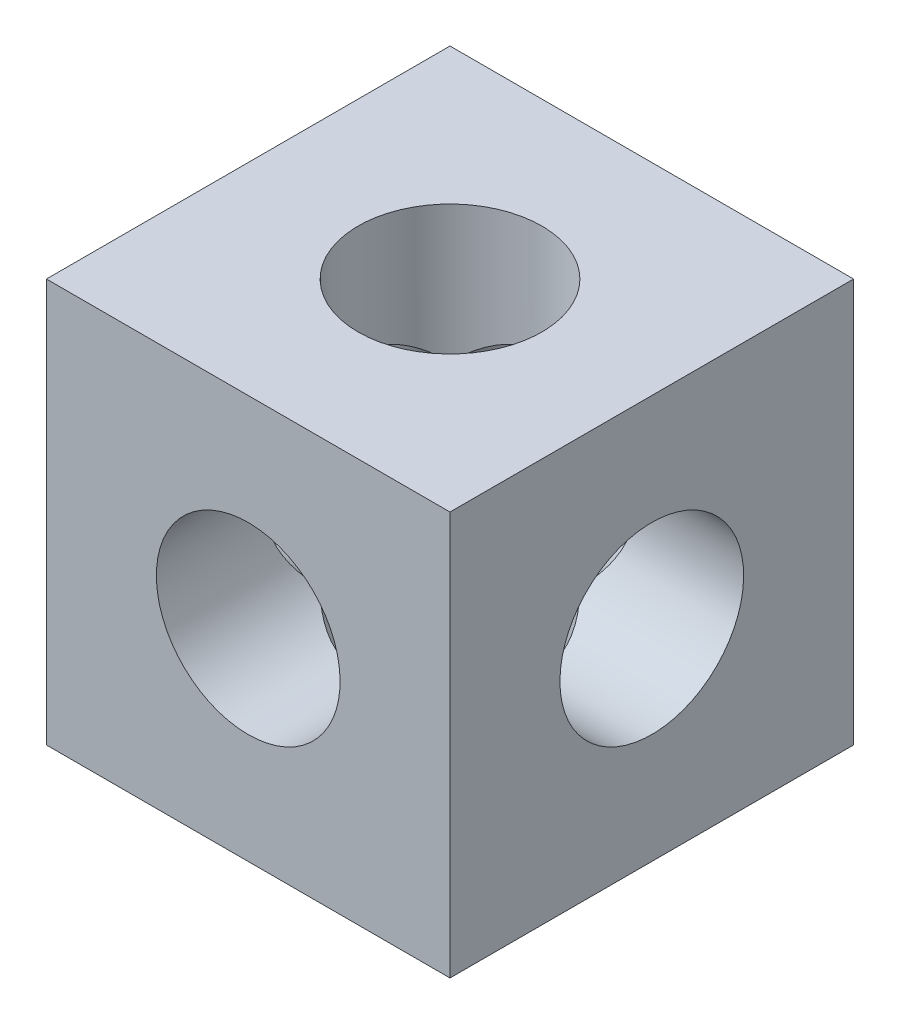
ISO-10303-21;
HEADER;
FILE_DESCRIPTION(('STEP AP214'),'2;1');
FILE_NAME('part.step','',(''),(''),'','','');
FILE_SCHEMA(('AUTOMOTIVE_DESIGN { 1 0 10303 214 1 1 1 1 }'));
ENDSEC;
DATA;
#1=APPLICATION_CONTEXT('core data for automotive mechanical design processes');
#2=APPLICATION_PROTOCOL_DEFINITION('international standard','automotive_design',2000,#1);
#3=PRODUCT_CONTEXT('',#1,'mechanical');
#4=PRODUCT('Part','Part','',(#3));
#5=PRODUCT_RELATED_PRODUCT_CATEGORY('part','',(#4));
#6=PRODUCT_DEFINITION_FORMATION('','',#4);
#7=PRODUCT_DEFINITION_CONTEXT('part definition',#1,'design');
#8=PRODUCT_DEFINITION('design','',#6,#7);
#9=PRODUCT_DEFINITION_SHAPE('','',#8);
#10=(LENGTH_UNIT() NAMED_UNIT(*) SI_UNIT(.MILLI.,.METRE.));
#11=(NAMED_UNIT(*) PLANE_ANGLE_UNIT() SI_UNIT($,.RADIAN.));
#12=(NAMED_UNIT(*) SI_UNIT($,.STERADIAN.) SOLID_ANGLE_UNIT());
#13=UNCERTAINTY_MEASURE_WITH_UNIT(LENGTH_MEASURE(1.E-05),#10,'distance_accuracy_value','');
#14=(GEOMETRIC_REPRESENTATION_CONTEXT(3) GLOBAL_UNCERTAINTY_ASSIGNED_CONTEXT((#13)) GLOBAL_UNIT_ASSIGNED_CONTEXT((#10,
#11,#12)) REPRESENTATION_CONTEXT('',''));
#15=CARTESIAN_POINT('',(0.,0.,0.));
#16=DIRECTION('',(0.,0.,1.));
#17=DIRECTION('',(1.,0.,0.));
#18=AXIS2_PLACEMENT_3D('',#15,#16,#17);
#19=CARTESIAN_POINT('',(17.4625,34.925,-17.4625));
#20=DIRECTION('',(0.,-1.,0.));
#21=DIRECTION('',(0.,0.,-1.));
#22=AXIS2_PLACEMENT_3D('',#19,#20,#21);
#23=CYLINDRICAL_SURFACE('',#22,7.9502);
#24=CARTESIAN_POINT('',(17.4625,0.,-17.4625));
#25=DIRECTION('',(0.,1.,0.));
#26=DIRECTION('',(0.,0.,1.));
#27=AXIS2_PLACEMENT_3D('',#24,#25,#26);
#28=CIRCLE('',#27,7.9502);
#29=CARTESIAN_POINT('',(17.4625,0.,-9.5123));
#30=VERTEX_POINT('',#29);
#31=EDGE_CURVE('E156',#30,#30,#28,.T.);
#32=ORIENTED_EDGE('',*,*,#31,.F.);
#33=EDGE_LOOP('',(#32));
#34=FACE_BOUND('',#33,.T.);
#35=CARTESIAN_POINT('',(17.4625,17.4625,-17.4625));
#36=DIRECTION('',(0.,-0.707106781186546,-0.707106781186549));
#37=DIRECTION('',(0.,-0.707106781186549,0.707106781186546));
#38=AXIS2_PLACEMENT_3D('',#35,#36,#37);
#39=ELLIPSE('',#38,11.2432806635786,7.9502);
#40=CARTESIAN_POINT('',(11.8408596682107,11.8408596682107,-11.8408596682107));
#41=VERTEX_POINT('',#40);
#42=CARTESIAN_POINT('',(23.0841403317893,11.8408596682107,-11.8408596682107));
#43=VERTEX_POINT('',#42);
#44=EDGE_CURVE('E106',#41,#43,#39,.F.);
#45=ORIENTED_EDGE('',*,*,#44,.T.);
#46=CARTESIAN_POINT('',(17.4625,17.4625,-17.4625));
#47=DIRECTION('',(-0.707106781186549,-0.707106781186546,0.));
#48=DIRECTION('',(0.707106781186546,-0.707106781186549,0.));
#49=AXIS2_PLACEMENT_3D('',#46,#47,#48);
#50=ELLIPSE('',#49,11.2432806635786,7.9502);
#51=CARTESIAN_POINT('',(23.0841403317893,11.8408596682107,-23.0841403317893));
#52=VERTEX_POINT('',#51);
#53=EDGE_CURVE('E52',#43,#52,#50,.F.);
#54=ORIENTED_EDGE('',*,*,#53,.T.);
#55=CARTESIAN_POINT('',(17.4625,17.4625,-17.4625));
#56=DIRECTION('',(0.,-0.707106781186549,0.707106781186546));
#57=DIRECTION('',(0.,-0.707106781186546,-0.707106781186549));
#58=AXIS2_PLACEMENT_3D('',#55,#56,#57);
#59=ELLIPSE('',#58,11.2432806635786,7.9502);
#60=CARTESIAN_POINT('',(11.8408596682107,11.8408596682107,-23.0841403317893));
#61=VERTEX_POINT('',#60);
#62=EDGE_CURVE('E111',#52,#61,#59,.F.);
#63=ORIENTED_EDGE('',*,*,#62,.T.);
#64=CARTESIAN_POINT('',(17.4625,17.4625,-17.4625));
#65=DIRECTION('',(0.707106781186546,-0.707106781186549,0.));
#66=DIRECTION('',(-0.707106781186549,-0.707106781186546,0.));
#67=AXIS2_PLACEMENT_3D('',#64,#65,#66);
#68=ELLIPSE('',#67,11.2432806635786,7.9502);
#69=EDGE_CURVE('E100',#61,#41,#68,.F.);
#70=ORIENTED_EDGE('',*,*,#69,.T.);
#71=EDGE_LOOP('',(#45,#54,#63,#70));
#72=FACE_BOUND('',#71,.T.);
#73=ADVANCED_FACE('F37',(#34,#72),#23,.F.);
#74=CARTESIAN_POINT('',(17.4625,34.925,-17.4625));
#75=DIRECTION('',(0.,1.,0.));
#76=DIRECTION('',(0.,0.,1.));
#77=AXIS2_PLACEMENT_3D('',#74,#75,#76);
#78=CIRCLE('',#77,7.9502);
#79=CARTESIAN_POINT('',(17.4625,34.925,-9.5123));
#80=VERTEX_POINT('',#79);
#81=EDGE_CURVE('E146',#80,#80,#78,.T.);
#82=ORIENTED_EDGE('',*,*,#81,.T.);
#83=EDGE_LOOP('',(#82));
#84=FACE_BOUND('',#83,.T.);
#85=CARTESIAN_POINT('',(17.4625,17.4625,-17.4625));
#86=DIRECTION('',(0.,-0.707106781186546,-0.707106781186549));
#87=DIRECTION('',(0.,-0.707106781186549,0.707106781186546));
#88=AXIS2_PLACEMENT_3D('',#85,#86,#87);
#89=ELLIPSE('',#88,11.2432806635786,7.9502);
#90=CARTESIAN_POINT('',(11.8408596682107,23.0841403317893,-23.0841403317893));
#91=VERTEX_POINT('',#90);
#92=CARTESIAN_POINT('',(23.0841403317893,23.0841403317893,-23.0841403317893));
#93=VERTEX_POINT('',#92);
#94=EDGE_CURVE('E115',#91,#93,#89,.T.);
#95=ORIENTED_EDGE('',*,*,#94,.T.);
#96=CARTESIAN_POINT('',(17.4625,17.4625,-17.4625));
#97=DIRECTION('',(0.707106781186546,-0.707106781186549,0.));
#98=DIRECTION('',(-0.707106781186549,-0.707106781186546,0.));
#99=AXIS2_PLACEMENT_3D('',#96,#97,#98);
#100=ELLIPSE('',#99,11.2432806635786,7.9502);
#101=CARTESIAN_POINT('',(23.0841403317893,23.0841403317893,-11.8408596682107));
#102=VERTEX_POINT('',#101);
#103=EDGE_CURVE('E112',#93,#102,#100,.T.);
#104=ORIENTED_EDGE('',*,*,#103,.T.);
#105=CARTESIAN_POINT('',(17.4625,17.4625,-17.4625));
#106=DIRECTION('',(0.,-0.707106781186549,0.707106781186546));
#107=DIRECTION('',(0.,-0.707106781186546,-0.707106781186549));
#108=AXIS2_PLACEMENT_3D('',#105,#106,#107);
#109=ELLIPSE('',#108,11.2432806635786,7.9502);
#110=CARTESIAN_POINT('',(11.8408596682107,23.0841403317893,-11.8408596682107));
#111=VERTEX_POINT('',#110);
#112=EDGE_CURVE('E118',#102,#111,#109,.T.);
#113=ORIENTED_EDGE('',*,*,#112,.T.);
#114=CARTESIAN_POINT('',(17.4625,17.4625,-17.4625));
#115=DIRECTION('',(-0.707106781186549,-0.707106781186546,0.));
#116=DIRECTION('',(0.707106781186546,-0.707106781186549,0.));
#117=AXIS2_PLACEMENT_3D('',#114,#115,#116);
#118=ELLIPSE('',#117,11.2432806635786,7.9502);
#119=EDGE_CURVE('E59',#111,#91,#118,.T.);
#120=ORIENTED_EDGE('',*,*,#119,.T.);
#121=EDGE_LOOP('',(#95,#104,#113,#120));
#122=FACE_BOUND('',#121,.T.);
#123=ADVANCED_FACE('F214',(#84,#122),#23,.F.);
#124=CARTESIAN_POINT('',(17.4625,17.4624999999999,0.));
#125=DIRECTION('',(0.,0.,-1.));
#126=DIRECTION('',(0.,1.,0.));
#127=AXIS2_PLACEMENT_3D('',#124,#125,#126);
#128=CYLINDRICAL_SURFACE('',#127,7.9502);
#129=CARTESIAN_POINT('',(17.4625,17.4625000000001,-34.925));
#130=DIRECTION('',(0.,0.,1.));
#131=DIRECTION('',(0.,-1.,0.));
#132=AXIS2_PLACEMENT_3D('',#129,#130,#131);
#133=CIRCLE('',#132,7.9502);
#134=CARTESIAN_POINT('',(17.4625,9.51230000000007,-34.925));
#135=VERTEX_POINT('',#134);
#136=EDGE_CURVE('E162',#135,#135,#133,.T.);
#137=ORIENTED_EDGE('',*,*,#136,.F.);
#138=EDGE_LOOP('',(#137));
#139=FACE_BOUND('',#138,.T.);
#140=ORIENTED_EDGE('',*,*,#62,.F.);
#141=CARTESIAN_POINT('',(17.4625,17.4625,-17.4625));
#142=DIRECTION('',(-0.707106781186546,0.,-0.707106781186549));
#143=DIRECTION('',(-0.707106781186549,0.,0.707106781186546));
#144=AXIS2_PLACEMENT_3D('',#141,#142,#143);
#145=ELLIPSE('',#144,11.2432806635786,7.9502);
#146=EDGE_CURVE('E171',#93,#52,#145,.T.);
#147=ORIENTED_EDGE('',*,*,#146,.F.);
#148=ORIENTED_EDGE('',*,*,#94,.F.);
#149=CARTESIAN_POINT('',(17.4625,17.4625,-17.4625));
#150=DIRECTION('',(-0.707106781186549,0.,0.707106781186546));
#151=DIRECTION('',(-0.707106781186546,0.,-0.707106781186549));
#152=AXIS2_PLACEMENT_3D('',#149,#150,#151);
#153=ELLIPSE('',#152,11.2432806635786,7.9502);
#154=EDGE_CURVE('E173',#61,#91,#153,.F.);
#155=ORIENTED_EDGE('',*,*,#154,.F.);
#156=EDGE_LOOP('',(#140,#147,#148,#155));
#157=FACE_BOUND('',#156,.T.);
#158=ADVANCED_FACE('F209',(#139,#157),#128,.F.);
#159=CARTESIAN_POINT('',(17.4625,17.4624999999999,0.));
#160=DIRECTION('',(0.,0.,1.));
#161=DIRECTION('',(0.,-1.,0.));
#162=AXIS2_PLACEMENT_3D('',#159,#160,#161);
#163=CIRCLE('',#162,7.9502);
#164=CARTESIAN_POINT('',(17.4625,9.51229999999994,0.));
#165=VERTEX_POINT('',#164);
#166=EDGE_CURVE('E159',#165,#165,#163,.T.);
#167=ORIENTED_EDGE('',*,*,#166,.T.);
#168=EDGE_LOOP('',(#167));
#169=FACE_BOUND('',#168,.T.);
#170=ORIENTED_EDGE('',*,*,#112,.F.);
#171=CARTESIAN_POINT('',(17.4625,17.4625,-17.4625));
#172=DIRECTION('',(0.707106781186547,0.,-0.707106781186547));
#173=DIRECTION('',(-0.707106781186547,0.,-0.707106781186547));
#174=AXIS2_PLACEMENT_3D('',#171,#172,#173);
#175=ELLIPSE('',#174,11.2432806635786,7.9502);
#176=EDGE_CURVE('E11',#102,#43,#175,.T.);
#177=ORIENTED_EDGE('',*,*,#176,.T.);
#178=ORIENTED_EDGE('',*,*,#44,.F.);
#179=CARTESIAN_POINT('',(17.4625,17.4625,-17.4625));
#180=DIRECTION('',(-0.707106781186547,0.,-0.707106781186547));
#181=DIRECTION('',(0.707106781186547,0.,-0.707106781186547));
#182=AXIS2_PLACEMENT_3D('',#179,#180,#181);
#183=ELLIPSE('',#182,11.2432806635786,7.9502);
#184=EDGE_CURVE('E45',#41,#111,#183,.T.);
#185=ORIENTED_EDGE('',*,*,#184,.T.);
#186=EDGE_LOOP('',(#170,#177,#178,#185));
#187=FACE_BOUND('',#186,.T.);
#188=ADVANCED_FACE('F114',(#169,#187),#128,.F.);
#189=CARTESIAN_POINT('',(0.,34.925,0.));
#190=DIRECTION('',(0.,0.,-1.));
#191=DIRECTION('',(-1.,0.,0.));
#192=AXIS2_PLACEMENT_3D('',#189,#190,#191);
#193=PLANE('',#192);
#194=ORIENTED_EDGE('',*,*,#166,.F.);
#195=EDGE_LOOP('',(#194));
#196=FACE_BOUND('',#195,.T.);
#197=DIRECTION('',(1.,0.,0.));
#198=VECTOR('',#197,1.);
#199=CARTESIAN_POINT('',(0.,0.,0.));
#200=LINE('',#199,#198);
#201=CARTESIAN_POINT('',(0.,0.,0.));
#202=VERTEX_POINT('',#201);
#203=CARTESIAN_POINT('',(34.925,0.,0.));
#204=VERTEX_POINT('',#203);
#205=EDGE_CURVE('E143',#202,#204,#200,.T.);
#206=ORIENTED_EDGE('',*,*,#205,.T.);
#207=DIRECTION('',(0.,-1.,0.));
#208=VECTOR('',#207,1.);
#209=CARTESIAN_POINT('',(34.925,34.925,0.));
#210=LINE('',#209,#208);
#211=CARTESIAN_POINT('',(34.925,34.925,0.));
#212=VERTEX_POINT('',#211);
#213=EDGE_CURVE('E123',#212,#204,#210,.T.);
#214=ORIENTED_EDGE('',*,*,#213,.F.);
#215=DIRECTION('',(1.,0.,0.));
#216=VECTOR('',#215,1.);
#217=CARTESIAN_POINT('',(0.,34.925,0.));
#218=LINE('',#217,#216);
#219=CARTESIAN_POINT('',(0.,34.925,0.));
#220=VERTEX_POINT('',#219);
#221=EDGE_CURVE('E136',#220,#212,#218,.T.);
#222=ORIENTED_EDGE('',*,*,#221,.F.);
#223=DIRECTION('',(0.,-1.,0.));
#224=VECTOR('',#223,1.);
#225=CARTESIAN_POINT('',(0.,34.925,0.));
#226=LINE('',#225,#224);
#227=EDGE_CURVE('E130',#220,#202,#226,.T.);
#228=ORIENTED_EDGE('',*,*,#227,.T.);
#229=EDGE_LOOP('',(#206,#214,#222,#228));
#230=FACE_BOUND('',#229,.T.);
#231=ADVANCED_FACE('F39',(#196,#230),#193,.F.);
#232=CARTESIAN_POINT('',(34.925,34.925,0.));
#233=DIRECTION('',(-1.,0.,0.));
#234=DIRECTION('',(0.,0.,1.));
#235=AXIS2_PLACEMENT_3D('',#232,#233,#234);
#236=PLANE('',#235);
#237=CARTESIAN_POINT('',(34.9250000000001,17.4624999999999,-17.4625));
#238=DIRECTION('',(1.,0.,0.));
#239=DIRECTION('',(0.,0.,1.));
#240=AXIS2_PLACEMENT_3D('',#237,#238,#239);
#241=CIRCLE('',#240,7.9502);
#242=CARTESIAN_POINT('',(34.9250000000001,17.4624999999999,-9.5123));
#243=VERTEX_POINT('',#242);
#244=EDGE_CURVE('E175',#243,#243,#241,.T.);
#245=ORIENTED_EDGE('',*,*,#244,.F.);
#246=EDGE_LOOP('',(#245));
#247=FACE_BOUND('',#246,.T.);
#248=DIRECTION('',(0.,0.,-1.));
#249=VECTOR('',#248,1.);
#250=CARTESIAN_POINT('',(34.925,0.,0.));
#251=LINE('',#250,#249);
#252=CARTESIAN_POINT('',(34.925,0.,-34.925));
#253=VERTEX_POINT('',#252);
#254=EDGE_CURVE('E140',#204,#253,#251,.T.);
#255=ORIENTED_EDGE('',*,*,#254,.T.);
#256=DIRECTION('',(0.,-1.,0.));
#257=VECTOR('',#256,1.);
#258=CARTESIAN_POINT('',(34.925,34.925,-34.925));
#259=LINE('',#258,#257);
#260=CARTESIAN_POINT('',(34.925,34.925,-34.925));
#261=VERTEX_POINT('',#260);
#262=EDGE_CURVE('E126',#261,#253,#259,.T.);
#263=ORIENTED_EDGE('',*,*,#262,.F.);
#264=DIRECTION('',(0.,0.,-1.));
#265=VECTOR('',#264,1.);
#266=CARTESIAN_POINT('',(34.925,34.925,0.));
#267=LINE('',#266,#265);
#268=EDGE_CURVE('E152',#212,#261,#267,.T.);
#269=ORIENTED_EDGE('',*,*,#268,.F.);
#270=ORIENTED_EDGE('',*,*,#213,.T.);
#271=EDGE_LOOP('',(#255,#263,#269,#270));
#272=FACE_BOUND('',#271,.T.);
#273=ADVANCED_FACE('F184',(#247,#272),#236,.F.);
#274=CARTESIAN_POINT('',(0.,34.925,-34.925));
#275=DIRECTION('',(0.,0.,-1.));
#276=DIRECTION('',(-1.,0.,0.));
#277=AXIS2_PLACEMENT_3D('',#274,#275,#276);
#278=PLANE('',#277);
#279=ORIENTED_EDGE('',*,*,#136,.T.);
#280=EDGE_LOOP('',(#279));
#281=FACE_BOUND('',#280,.T.);
#282=DIRECTION('',(1.,0.,0.));
#283=VECTOR('',#282,1.);
#284=CARTESIAN_POINT('',(0.,0.,-34.925));
#285=LINE('',#284,#283);
#286=CARTESIAN_POINT('',(0.,0.,-34.925));
#287=VERTEX_POINT('',#286);
#288=EDGE_CURVE('E137',#287,#253,#285,.T.);
#289=ORIENTED_EDGE('',*,*,#288,.F.);
#290=DIRECTION('',(0.,-1.,0.));
#291=VECTOR('',#290,1.);
#292=CARTESIAN_POINT('',(0.,34.925,-34.925));
#293=LINE('',#292,#291);
#294=CARTESIAN_POINT('',(0.,34.925,-34.925));
#295=VERTEX_POINT('',#294);
#296=EDGE_CURVE('E128',#295,#287,#293,.T.);
#297=ORIENTED_EDGE('',*,*,#296,.F.);
#298=DIRECTION('',(1.,0.,0.));
#299=VECTOR('',#298,1.);
#300=CARTESIAN_POINT('',(0.,34.925,-34.925));
#301=LINE('',#300,#299);
#302=EDGE_CURVE('E149',#295,#261,#301,.T.);
#303=ORIENTED_EDGE('',*,*,#302,.T.);
#304=ORIENTED_EDGE('',*,*,#262,.T.);
#305=EDGE_LOOP('',(#289,#297,#303,#304));
#306=FACE_BOUND('',#305,.T.);
#307=ADVANCED_FACE('F187',(#281,#306),#278,.T.);
#308=CARTESIAN_POINT('',(0.,34.925,0.));
#309=DIRECTION('',(-1.,0.,0.));
#310=DIRECTION('',(0.,0.,1.));
#311=AXIS2_PLACEMENT_3D('',#308,#309,#310);
#312=PLANE('',#311);
#313=CARTESIAN_POINT('',(0.,17.4625000000001,-17.4625));
#314=DIRECTION('',(1.,0.,0.));
#315=DIRECTION('',(0.,0.,1.));
#316=AXIS2_PLACEMENT_3D('',#313,#314,#315);
#317=CIRCLE('',#316,7.9502);
#318=CARTESIAN_POINT('',(0.,17.4625000000001,-9.5123));
#319=VERTEX_POINT('',#318);
#320=EDGE_CURVE('E176',#319,#319,#317,.T.);
#321=ORIENTED_EDGE('',*,*,#320,.T.);
#322=EDGE_LOOP('',(#321));
#323=FACE_BOUND('',#322,.T.);
#324=DIRECTION('',(0.,0.,-1.));
#325=VECTOR('',#324,1.);
#326=CARTESIAN_POINT('',(0.,0.,0.));
#327=LINE('',#326,#325);
#328=EDGE_CURVE('E133',#202,#287,#327,.T.);
#329=ORIENTED_EDGE('',*,*,#328,.F.);
#330=ORIENTED_EDGE('',*,*,#227,.F.);
#331=DIRECTION('',(0.,0.,-1.));
#332=VECTOR('',#331,1.);
#333=CARTESIAN_POINT('',(0.,34.925,0.));
#334=LINE('',#333,#332);
#335=EDGE_CURVE('E132',#220,#295,#334,.T.);
#336=ORIENTED_EDGE('',*,*,#335,.T.);
#337=ORIENTED_EDGE('',*,*,#296,.T.);
#338=EDGE_LOOP('',(#329,#330,#336,#337));
#339=FACE_BOUND('',#338,.T.);
#340=ADVANCED_FACE('F201',(#323,#339),#312,.T.);
#341=CARTESIAN_POINT('',(0.,34.925,0.));
#342=DIRECTION('',(0.,1.,0.));
#343=DIRECTION('',(0.,0.,1.));
#344=AXIS2_PLACEMENT_3D('',#341,#342,#343);
#345=PLANE('',#344);
#346=ORIENTED_EDGE('',*,*,#81,.F.);
#347=EDGE_LOOP('',(#346));
#348=FACE_BOUND('',#347,.T.);
#349=ORIENTED_EDGE('',*,*,#221,.T.);
#350=ORIENTED_EDGE('',*,*,#268,.T.);
#351=ORIENTED_EDGE('',*,*,#302,.F.);
#352=ORIENTED_EDGE('',*,*,#335,.F.);
#353=EDGE_LOOP('',(#349,#350,#351,#352));
#354=FACE_BOUND('',#353,.T.);
#355=ADVANCED_FACE('F199',(#348,#354),#345,.T.);
#356=CARTESIAN_POINT('',(0.,0.,0.));
#357=DIRECTION('',(0.,1.,0.));
#358=DIRECTION('',(0.,0.,1.));
#359=AXIS2_PLACEMENT_3D('',#356,#357,#358);
#360=PLANE('',#359);
#361=ORIENTED_EDGE('',*,*,#31,.T.);
#362=EDGE_LOOP('',(#361));
#363=FACE_BOUND('',#362,.T.);
#364=ORIENTED_EDGE('',*,*,#205,.F.);
#365=ORIENTED_EDGE('',*,*,#328,.T.);
#366=ORIENTED_EDGE('',*,*,#288,.T.);
#367=ORIENTED_EDGE('',*,*,#254,.F.);
#368=EDGE_LOOP('',(#364,#365,#366,#367));
#369=FACE_BOUND('',#368,.T.);
#370=ADVANCED_FACE('F193',(#363,#369),#360,.F.);
#371=CARTESIAN_POINT('',(34.9250000000001,17.4624999999999,-17.4625));
#372=DIRECTION('',(-1.,0.,0.));
#373=DIRECTION('',(0.,-1.,0.));
#374=AXIS2_PLACEMENT_3D('',#371,#372,#373);
#375=CYLINDRICAL_SURFACE('',#374,7.9502);
#376=ORIENTED_EDGE('',*,*,#320,.F.);
#377=EDGE_LOOP('',(#376));
#378=FACE_BOUND('',#377,.T.);
#379=ORIENTED_EDGE('',*,*,#154,.T.);
#380=ORIENTED_EDGE('',*,*,#119,.F.);
#381=ORIENTED_EDGE('',*,*,#184,.F.);
#382=ORIENTED_EDGE('',*,*,#69,.F.);
#383=EDGE_LOOP('',(#379,#380,#381,#382));
#384=FACE_BOUND('',#383,.T.);
#385=ADVANCED_FACE('F99',(#378,#384),#375,.F.);
#386=ORIENTED_EDGE('',*,*,#244,.T.);
#387=EDGE_LOOP('',(#386));
#388=FACE_BOUND('',#387,.T.);
#389=ORIENTED_EDGE('',*,*,#176,.F.);
#390=ORIENTED_EDGE('',*,*,#103,.F.);
#391=ORIENTED_EDGE('',*,*,#146,.T.);
#392=ORIENTED_EDGE('',*,*,#53,.F.);
#393=EDGE_LOOP('',(#389,#390,#391,#392));
#394=FACE_BOUND('',#393,.T.);
#395=ADVANCED_FACE('F182',(#388,#394),#375,.F.);
#396=CLOSED_SHELL('',(#73,#123,#158,#188,#231,#273,#307,#340,#355,#370,#385,#395));
#397=MANIFOLD_SOLID_BREP('B2',#396);
#398=ADVANCED_BREP_SHAPE_REPRESENTATION('',(#18,#397),#14);
#399=SHAPE_DEFINITION_REPRESENTATION(#9,#398);
ENDSEC;
END-ISO-10303-21;
